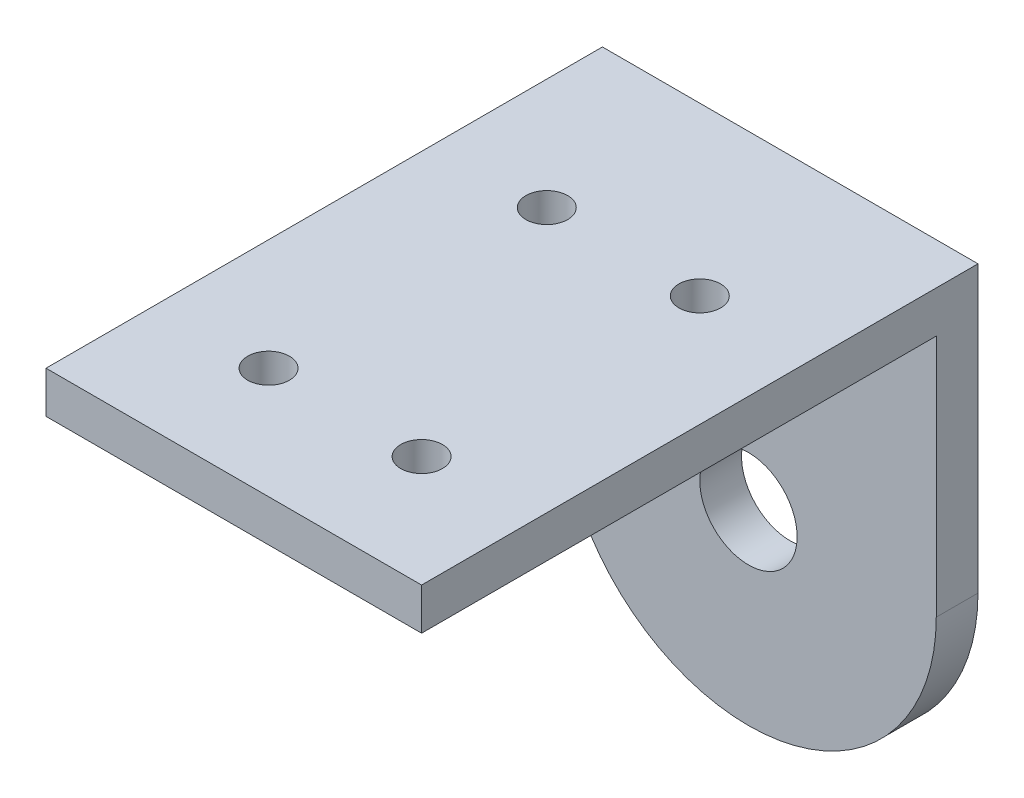
ISO-10303-21;
HEADER;
FILE_DESCRIPTION(('STEP AP214'),'2;1');
FILE_NAME('part.step','',(''),(''),'','','');
FILE_SCHEMA(('AUTOMOTIVE_DESIGN { 1 0 10303 214 1 1 1 1 }'));
ENDSEC;
DATA;
#1=APPLICATION_CONTEXT('core data for automotive mechanical design processes');
#2=APPLICATION_PROTOCOL_DEFINITION('international standard','automotive_design',2000,#1);
#3=PRODUCT_CONTEXT('',#1,'mechanical');
#4=PRODUCT('Part','Part','',(#3));
#5=PRODUCT_RELATED_PRODUCT_CATEGORY('part','',(#4));
#6=PRODUCT_DEFINITION_FORMATION('','',#4);
#7=PRODUCT_DEFINITION_CONTEXT('part definition',#1,'design');
#8=PRODUCT_DEFINITION('design','',#6,#7);
#9=PRODUCT_DEFINITION_SHAPE('','',#8);
#10=(LENGTH_UNIT() NAMED_UNIT(*) SI_UNIT(.MILLI.,.METRE.));
#11=(NAMED_UNIT(*) PLANE_ANGLE_UNIT() SI_UNIT($,.RADIAN.));
#12=(NAMED_UNIT(*) SI_UNIT($,.STERADIAN.) SOLID_ANGLE_UNIT());
#13=UNCERTAINTY_MEASURE_WITH_UNIT(LENGTH_MEASURE(1.E-05),#10,'distance_accuracy_value','');
#14=(GEOMETRIC_REPRESENTATION_CONTEXT(3) GLOBAL_UNCERTAINTY_ASSIGNED_CONTEXT((#13)) GLOBAL_UNIT_ASSIGNED_CONTEXT((#10,
#11,#12)) REPRESENTATION_CONTEXT('',''));
#15=CARTESIAN_POINT('',(0.,0.,0.));
#16=DIRECTION('',(0.,0.,1.));
#17=DIRECTION('',(1.,0.,0.));
#18=AXIS2_PLACEMENT_3D('',#15,#16,#17);
#19=CARTESIAN_POINT('',(2606.26671450499,1592.8264256332,40.));
#20=DIRECTION('',(0.,0.,1.));
#21=DIRECTION('',(1.,0.,0.));
#22=AXIS2_PLACEMENT_3D('',#19,#20,#21);
#23=PLANE('',#22);
#24=DIRECTION('',(1.,0.,0.));
#25=VECTOR('',#24,1.);
#26=CARTESIAN_POINT('',(2579.76671450502,1610.3264256332,40.));
#27=LINE('',#26,#25);
#28=CARTESIAN_POINT('',(2592.76671450499,1610.3264256332,40.));
#29=VERTEX_POINT('',#28);
#30=CARTESIAN_POINT('',(2619.76671450502,1610.3264256332,40.));
#31=VERTEX_POINT('',#30);
#32=EDGE_CURVE('E122',#29,#31,#27,.T.);
#33=ORIENTED_EDGE('',*,*,#32,.T.);
#34=DIRECTION('',(0.,1.,0.));
#35=VECTOR('',#34,1.);
#36=CARTESIAN_POINT('',(2619.76671450499,1592.8264256332,40.));
#37=LINE('',#36,#35);
#38=CARTESIAN_POINT('',(2619.76671450499,1613.3264256332,40.));
#39=VERTEX_POINT('',#38);
#40=EDGE_CURVE('E98',#31,#39,#37,.T.);
#41=ORIENTED_EDGE('',*,*,#40,.T.);
#42=DIRECTION('',(-1.,0.,0.));
#43=VECTOR('',#42,1.);
#44=CARTESIAN_POINT('',(2592.76671450499,1613.3264256332,40.));
#45=LINE('',#44,#43);
#46=CARTESIAN_POINT('',(2592.76671450499,1613.3264256332,40.));
#47=VERTEX_POINT('',#46);
#48=EDGE_CURVE('E58',#39,#47,#45,.T.);
#49=ORIENTED_EDGE('',*,*,#48,.T.);
#50=DIRECTION('',(0.,-1.,0.));
#51=VECTOR('',#50,1.);
#52=CARTESIAN_POINT('',(2592.76671450499,1592.8264256332,40.));
#53=LINE('',#52,#51);
#54=EDGE_CURVE('E89',#47,#29,#53,.T.);
#55=ORIENTED_EDGE('',*,*,#54,.T.);
#56=EDGE_LOOP('',(#33,#41,#49,#55));
#57=FACE_BOUND('',#56,.T.);
#58=ADVANCED_FACE('F32',(#57),#23,.T.);
#59=CARTESIAN_POINT('',(2606.26671450499,1592.8264256332,0.));
#60=DIRECTION('',(0.,0.,1.));
#61=DIRECTION('',(1.,0.,0.));
#62=AXIS2_PLACEMENT_3D('',#59,#60,#61);
#63=PLANE('',#62);
#64=CARTESIAN_POINT('',(2606.26671450499,1592.8264256332,0.));
#65=DIRECTION('',(0.,0.,1.));
#66=DIRECTION('',(1.,0.,0.));
#67=AXIS2_PLACEMENT_3D('',#64,#65,#66);
#68=CIRCLE('',#67,13.5000000000001);
#69=CARTESIAN_POINT('',(2592.76671450499,1592.8264256332,0.));
#70=VERTEX_POINT('',#69);
#71=CARTESIAN_POINT('',(2619.76671450499,1592.8264256332,0.));
#72=VERTEX_POINT('',#71);
#73=EDGE_CURVE('E82',#70,#72,#68,.T.);
#74=ORIENTED_EDGE('',*,*,#73,.F.);
#75=DIRECTION('',(0.,-1.,0.));
#76=VECTOR('',#75,1.);
#77=CARTESIAN_POINT('',(2592.76671450499,1592.8264256332,0.));
#78=LINE('',#77,#76);
#79=CARTESIAN_POINT('',(2592.76671450499,1613.3264256332,0.));
#80=VERTEX_POINT('',#79);
#81=EDGE_CURVE('E93',#80,#70,#78,.T.);
#82=ORIENTED_EDGE('',*,*,#81,.F.);
#83=DIRECTION('',(-1.,0.,0.));
#84=VECTOR('',#83,1.);
#85=CARTESIAN_POINT('',(2592.76671450499,1613.3264256332,0.));
#86=LINE('',#85,#84);
#87=CARTESIAN_POINT('',(2619.76671450499,1613.3264256332,0.));
#88=VERTEX_POINT('',#87);
#89=EDGE_CURVE('E99',#88,#80,#86,.T.);
#90=ORIENTED_EDGE('',*,*,#89,.F.);
#91=DIRECTION('',(0.,1.,0.));
#92=VECTOR('',#91,1.);
#93=CARTESIAN_POINT('',(2619.76671450499,1592.8264256332,0.));
#94=LINE('',#93,#92);
#95=EDGE_CURVE('E104',#72,#88,#94,.T.);
#96=ORIENTED_EDGE('',*,*,#95,.F.);
#97=EDGE_LOOP('',(#74,#82,#90,#96));
#98=FACE_BOUND('',#97,.T.);
#99=CARTESIAN_POINT('',(2606.26671450499,1592.8264256332,0.));
#100=DIRECTION('',(0.,0.,1.));
#101=DIRECTION('',(1.,0.,0.));
#102=AXIS2_PLACEMENT_3D('',#99,#100,#101);
#103=CIRCLE('',#102,3.49999999999984);
#104=CARTESIAN_POINT('',(2609.76671450499,1592.8264256332,0.));
#105=VERTEX_POINT('',#104);
#106=EDGE_CURVE('E105',#105,#105,#103,.T.);
#107=ORIENTED_EDGE('',*,*,#106,.T.);
#108=EDGE_LOOP('',(#107));
#109=FACE_BOUND('',#108,.T.);
#110=ADVANCED_FACE('F102',(#98,#109),#63,.F.);
#111=CARTESIAN_POINT('',(2606.26671450499,1592.8264256332,40.));
#112=DIRECTION('',(0.,0.,-1.));
#113=DIRECTION('',(-1.,0.,0.));
#114=AXIS2_PLACEMENT_3D('',#111,#112,#113);
#115=CYLINDRICAL_SURFACE('',#114,13.5000000000001);
#116=DIRECTION('',(0.,0.,-1.));
#117=VECTOR('',#116,1.);
#118=CARTESIAN_POINT('',(2619.76671450499,1592.8264256332,40.));
#119=LINE('',#118,#117);
#120=CARTESIAN_POINT('',(2619.76671450502,1592.8264256332,3.));
#121=VERTEX_POINT('',#120);
#122=EDGE_CURVE('E41',#121,#72,#119,.T.);
#123=ORIENTED_EDGE('',*,*,#122,.F.);
#124=CARTESIAN_POINT('',(2606.26671450499,1592.8264256332,3.));
#125=DIRECTION('',(0.,0.,-1.));
#126=DIRECTION('',(0.,1.,0.));
#127=AXIS2_PLACEMENT_3D('',#124,#125,#126);
#128=CIRCLE('',#127,13.5000000000001);
#129=CARTESIAN_POINT('',(2592.76671450499,1592.8264256332,3.));
#130=VERTEX_POINT('',#129);
#131=EDGE_CURVE('E85',#121,#130,#128,.T.);
#132=ORIENTED_EDGE('',*,*,#131,.T.);
#133=DIRECTION('',(0.,0.,-1.));
#134=VECTOR('',#133,1.);
#135=CARTESIAN_POINT('',(2592.76671450499,1592.8264256332,40.));
#136=LINE('',#135,#134);
#137=EDGE_CURVE('E78',#130,#70,#136,.T.);
#138=ORIENTED_EDGE('',*,*,#137,.T.);
#139=ORIENTED_EDGE('',*,*,#73,.T.);
#140=EDGE_LOOP('',(#123,#132,#138,#139));
#141=FACE_BOUND('',#140,.T.);
#142=ADVANCED_FACE('F34',(#141),#115,.T.);
#143=CARTESIAN_POINT('',(2619.76671450499,1592.8264256332,40.));
#144=DIRECTION('',(-1.,0.,0.));
#145=DIRECTION('',(0.,0.,1.));
#146=AXIS2_PLACEMENT_3D('',#143,#144,#145);
#147=PLANE('',#146);
#148=ORIENTED_EDGE('',*,*,#40,.F.);
#149=DIRECTION('',(0.,0.,1.));
#150=VECTOR('',#149,1.);
#151=CARTESIAN_POINT('',(2619.76671450502,1610.3264256332,40.));
#152=LINE('',#151,#150);
#153=CARTESIAN_POINT('',(2619.76671450502,1610.3264256332,3.));
#154=VERTEX_POINT('',#153);
#155=EDGE_CURVE('E150',#154,#31,#152,.T.);
#156=ORIENTED_EDGE('',*,*,#155,.F.);
#157=DIRECTION('',(0.,1.,0.));
#158=VECTOR('',#157,1.);
#159=CARTESIAN_POINT('',(2619.76671450502,1610.3264256332,3.));
#160=LINE('',#159,#158);
#161=EDGE_CURVE('E127',#121,#154,#160,.T.);
#162=ORIENTED_EDGE('',*,*,#161,.F.);
#163=ORIENTED_EDGE('',*,*,#122,.T.);
#164=ORIENTED_EDGE('',*,*,#95,.T.);
#165=DIRECTION('',(0.,0.,-1.));
#166=VECTOR('',#165,1.);
#167=CARTESIAN_POINT('',(2619.76671450499,1613.3264256332,40.));
#168=LINE('',#167,#166);
#169=EDGE_CURVE('E115',#39,#88,#168,.T.);
#170=ORIENTED_EDGE('',*,*,#169,.F.);
#171=EDGE_LOOP('',(#148,#156,#162,#163,#164,#170));
#172=FACE_BOUND('',#171,.T.);
#173=ADVANCED_FACE('F169',(#172),#147,.F.);
#174=CARTESIAN_POINT('',(2592.76671450499,1613.3264256332,40.));
#175=DIRECTION('',(0.,-1.,0.));
#176=DIRECTION('',(0.,0.,-1.));
#177=AXIS2_PLACEMENT_3D('',#174,#175,#176);
#178=PLANE('',#177);
#179=CARTESIAN_POINT('',(2600.76671450499,1613.3264256332,12.));
#180=DIRECTION('',(0.,1.,0.));
#181=DIRECTION('',(0.,0.,1.));
#182=AXIS2_PLACEMENT_3D('',#179,#180,#181);
#183=CIRCLE('',#182,1.50000000000008);
#184=CARTESIAN_POINT('',(2600.76671450499,1613.3264256332,13.5000000000001));
#185=VERTEX_POINT('',#184);
#186=EDGE_CURVE('E144',#185,#185,#183,.T.);
#187=ORIENTED_EDGE('',*,*,#186,.F.);
#188=EDGE_LOOP('',(#187));
#189=FACE_BOUND('',#188,.T.);
#190=CARTESIAN_POINT('',(2611.76671450499,1613.3264256332,12.));
#191=DIRECTION('',(0.,1.,0.));
#192=DIRECTION('',(0.,0.,1.));
#193=AXIS2_PLACEMENT_3D('',#190,#191,#192);
#194=CIRCLE('',#193,1.50000000000008);
#195=CARTESIAN_POINT('',(2611.76671450499,1613.3264256332,13.5000000000001));
#196=VERTEX_POINT('',#195);
#197=EDGE_CURVE('E134',#196,#196,#194,.T.);
#198=ORIENTED_EDGE('',*,*,#197,.F.);
#199=EDGE_LOOP('',(#198));
#200=FACE_BOUND('',#199,.T.);
#201=CARTESIAN_POINT('',(2611.76671450499,1613.3264256332,32.));
#202=DIRECTION('',(0.,1.,0.));
#203=DIRECTION('',(0.,0.,1.));
#204=AXIS2_PLACEMENT_3D('',#201,#202,#203);
#205=CIRCLE('',#204,1.50000000000008);
#206=CARTESIAN_POINT('',(2611.76671450499,1613.3264256332,33.5000000000001));
#207=VERTEX_POINT('',#206);
#208=EDGE_CURVE('E131',#207,#207,#205,.T.);
#209=ORIENTED_EDGE('',*,*,#208,.F.);
#210=EDGE_LOOP('',(#209));
#211=FACE_BOUND('',#210,.T.);
#212=CARTESIAN_POINT('',(2600.76671450499,1613.3264256332,32.));
#213=DIRECTION('',(0.,1.,0.));
#214=DIRECTION('',(0.,0.,1.));
#215=AXIS2_PLACEMENT_3D('',#212,#213,#214);
#216=CIRCLE('',#215,1.50000000000008);
#217=CARTESIAN_POINT('',(2600.76671450499,1613.3264256332,33.5000000000001));
#218=VERTEX_POINT('',#217);
#219=EDGE_CURVE('E128',#218,#218,#216,.T.);
#220=ORIENTED_EDGE('',*,*,#219,.F.);
#221=EDGE_LOOP('',(#220));
#222=FACE_BOUND('',#221,.T.);
#223=ORIENTED_EDGE('',*,*,#89,.T.);
#224=DIRECTION('',(0.,0.,-1.));
#225=VECTOR('',#224,1.);
#226=CARTESIAN_POINT('',(2592.76671450499,1613.3264256332,40.));
#227=LINE('',#226,#225);
#228=EDGE_CURVE('E88',#47,#80,#227,.T.);
#229=ORIENTED_EDGE('',*,*,#228,.F.);
#230=ORIENTED_EDGE('',*,*,#48,.F.);
#231=ORIENTED_EDGE('',*,*,#169,.T.);
#232=EDGE_LOOP('',(#223,#229,#230,#231));
#233=FACE_BOUND('',#232,.T.);
#234=ADVANCED_FACE('F199',(#189,#200,#211,#222,#233),#178,.F.);
#235=CARTESIAN_POINT('',(2592.76671450499,1592.8264256332,40.));
#236=DIRECTION('',(1.,0.,0.));
#237=DIRECTION('',(0.,0.,-1.));
#238=AXIS2_PLACEMENT_3D('',#235,#236,#237);
#239=PLANE('',#238);
#240=DIRECTION('',(0.,1.,0.));
#241=VECTOR('',#240,1.);
#242=CARTESIAN_POINT('',(2592.76671450499,1592.8264256332,3.));
#243=LINE('',#242,#241);
#244=CARTESIAN_POINT('',(2592.76671450499,1610.3264256332,3.));
#245=VERTEX_POINT('',#244);
#246=EDGE_CURVE('E121',#130,#245,#243,.T.);
#247=ORIENTED_EDGE('',*,*,#246,.T.);
#248=DIRECTION('',(0.,0.,1.));
#249=VECTOR('',#248,1.);
#250=CARTESIAN_POINT('',(2592.76671450499,1610.3264256332,40.));
#251=LINE('',#250,#249);
#252=EDGE_CURVE('E11',#245,#29,#251,.T.);
#253=ORIENTED_EDGE('',*,*,#252,.T.);
#254=ORIENTED_EDGE('',*,*,#54,.F.);
#255=ORIENTED_EDGE('',*,*,#228,.T.);
#256=ORIENTED_EDGE('',*,*,#81,.T.);
#257=ORIENTED_EDGE('',*,*,#137,.F.);
#258=EDGE_LOOP('',(#247,#253,#254,#255,#256,#257));
#259=FACE_BOUND('',#258,.T.);
#260=ADVANCED_FACE('F94',(#259),#239,.F.);
#261=CARTESIAN_POINT('',(2606.26671450499,1592.8264256332,40.));
#262=DIRECTION('',(0.,0.,-1.));
#263=DIRECTION('',(-1.,0.,0.));
#264=AXIS2_PLACEMENT_3D('',#261,#262,#263);
#265=CYLINDRICAL_SURFACE('',#264,3.49999999999984);
#266=CARTESIAN_POINT('',(2606.26671450499,1592.8264256332,3.));
#267=DIRECTION('',(0.,0.,-1.));
#268=DIRECTION('',(0.,1.,0.));
#269=AXIS2_PLACEMENT_3D('',#266,#267,#268);
#270=CIRCLE('',#269,3.49999999999984);
#271=CARTESIAN_POINT('',(2606.26671450499,1596.3264256332,3.));
#272=VERTEX_POINT('',#271);
#273=EDGE_CURVE('E119',#272,#272,#270,.T.);
#274=ORIENTED_EDGE('',*,*,#273,.F.);
#275=EDGE_LOOP('',(#274));
#276=FACE_BOUND('',#275,.T.);
#277=ORIENTED_EDGE('',*,*,#106,.F.);
#278=EDGE_LOOP('',(#277));
#279=FACE_BOUND('',#278,.T.);
#280=ADVANCED_FACE('F186',(#276,#279),#265,.F.);
#281=CARTESIAN_POINT('',(2579.76671450502,1610.3264256332,40.));
#282=DIRECTION('',(0.,1.,0.));
#283=DIRECTION('',(-1.,0.,0.));
#284=AXIS2_PLACEMENT_3D('',#281,#282,#283);
#285=PLANE('',#284);
#286=CARTESIAN_POINT('',(2600.76671450499,1610.3264256332,12.));
#287=DIRECTION('',(0.,1.,0.));
#288=DIRECTION('',(-1.,0.,0.));
#289=AXIS2_PLACEMENT_3D('',#286,#287,#288);
#290=CIRCLE('',#289,1.50000000000008);
#291=CARTESIAN_POINT('',(2599.26671450499,1610.3264256332,12.));
#292=VERTEX_POINT('',#291);
#293=EDGE_CURVE('E36',#292,#292,#290,.T.);
#294=ORIENTED_EDGE('',*,*,#293,.T.);
#295=EDGE_LOOP('',(#294));
#296=FACE_BOUND('',#295,.T.);
#297=CARTESIAN_POINT('',(2611.76671450499,1610.3264256332,12.));
#298=DIRECTION('',(0.,1.,0.));
#299=DIRECTION('',(-1.,0.,0.));
#300=AXIS2_PLACEMENT_3D('',#297,#298,#299);
#301=CIRCLE('',#300,1.50000000000008);
#302=CARTESIAN_POINT('',(2610.26671450499,1610.3264256332,12.));
#303=VERTEX_POINT('',#302);
#304=EDGE_CURVE('E132',#303,#303,#301,.T.);
#305=ORIENTED_EDGE('',*,*,#304,.T.);
#306=EDGE_LOOP('',(#305));
#307=FACE_BOUND('',#306,.T.);
#308=CARTESIAN_POINT('',(2611.76671450499,1610.3264256332,32.));
#309=DIRECTION('',(0.,1.,0.));
#310=DIRECTION('',(-1.,0.,0.));
#311=AXIS2_PLACEMENT_3D('',#308,#309,#310);
#312=CIRCLE('',#311,1.50000000000008);
#313=CARTESIAN_POINT('',(2610.26671450499,1610.3264256332,32.));
#314=VERTEX_POINT('',#313);
#315=EDGE_CURVE('E129',#314,#314,#312,.T.);
#316=ORIENTED_EDGE('',*,*,#315,.T.);
#317=EDGE_LOOP('',(#316));
#318=FACE_BOUND('',#317,.T.);
#319=CARTESIAN_POINT('',(2600.76671450499,1610.3264256332,32.));
#320=DIRECTION('',(0.,1.,0.));
#321=DIRECTION('',(-1.,0.,0.));
#322=AXIS2_PLACEMENT_3D('',#319,#320,#321);
#323=CIRCLE('',#322,1.50000000000008);
#324=CARTESIAN_POINT('',(2599.26671450499,1610.3264256332,32.));
#325=VERTEX_POINT('',#324);
#326=EDGE_CURVE('E124',#325,#325,#323,.T.);
#327=ORIENTED_EDGE('',*,*,#326,.T.);
#328=EDGE_LOOP('',(#327));
#329=FACE_BOUND('',#328,.T.);
#330=DIRECTION('',(1.,0.,0.));
#331=VECTOR('',#330,1.);
#332=CARTESIAN_POINT('',(2579.76671450502,1610.3264256332,3.));
#333=LINE('',#332,#331);
#334=EDGE_CURVE('E49',#245,#154,#333,.T.);
#335=ORIENTED_EDGE('',*,*,#334,.T.);
#336=ORIENTED_EDGE('',*,*,#155,.T.);
#337=ORIENTED_EDGE('',*,*,#32,.F.);
#338=ORIENTED_EDGE('',*,*,#252,.F.);
#339=EDGE_LOOP('',(#335,#336,#337,#338));
#340=FACE_BOUND('',#339,.T.);
#341=ADVANCED_FACE('F162',(#296,#307,#318,#329,#340),#285,.F.);
#342=CARTESIAN_POINT('',(2579.76671450502,1610.3264256332,3.));
#343=DIRECTION('',(0.,0.,-1.));
#344=DIRECTION('',(0.,1.,0.));
#345=AXIS2_PLACEMENT_3D('',#342,#343,#344);
#346=PLANE('',#345);
#347=ORIENTED_EDGE('',*,*,#273,.T.);
#348=EDGE_LOOP('',(#347));
#349=FACE_BOUND('',#348,.T.);
#350=ORIENTED_EDGE('',*,*,#161,.T.);
#351=ORIENTED_EDGE('',*,*,#334,.F.);
#352=ORIENTED_EDGE('',*,*,#246,.F.);
#353=ORIENTED_EDGE('',*,*,#131,.F.);
#354=EDGE_LOOP('',(#350,#351,#352,#353));
#355=FACE_BOUND('',#354,.T.);
#356=ADVANCED_FACE('F174',(#349,#355),#346,.F.);
#357=CARTESIAN_POINT('',(2600.76671450499,1573.3264256332,32.));
#358=DIRECTION('',(0.,1.,0.));
#359=DIRECTION('',(0.,0.,1.));
#360=AXIS2_PLACEMENT_3D('',#357,#358,#359);
#361=CYLINDRICAL_SURFACE('',#360,1.50000000000008);
#362=ORIENTED_EDGE('',*,*,#219,.T.);
#363=EDGE_LOOP('',(#362));
#364=FACE_BOUND('',#363,.T.);
#365=ORIENTED_EDGE('',*,*,#326,.F.);
#366=EDGE_LOOP('',(#365));
#367=FACE_BOUND('',#366,.T.);
#368=ADVANCED_FACE('F176',(#364,#367),#361,.F.);
#369=CARTESIAN_POINT('',(2611.76671450499,1573.3264256332,32.));
#370=DIRECTION('',(0.,1.,0.));
#371=DIRECTION('',(0.,0.,1.));
#372=AXIS2_PLACEMENT_3D('',#369,#370,#371);
#373=CYLINDRICAL_SURFACE('',#372,1.50000000000008);
#374=ORIENTED_EDGE('',*,*,#208,.T.);
#375=EDGE_LOOP('',(#374));
#376=FACE_BOUND('',#375,.T.);
#377=ORIENTED_EDGE('',*,*,#315,.F.);
#378=EDGE_LOOP('',(#377));
#379=FACE_BOUND('',#378,.T.);
#380=ADVANCED_FACE('F183',(#376,#379),#373,.F.);
#381=CARTESIAN_POINT('',(2611.76671450499,1573.3264256332,12.));
#382=DIRECTION('',(0.,1.,0.));
#383=DIRECTION('',(0.,0.,1.));
#384=AXIS2_PLACEMENT_3D('',#381,#382,#383);
#385=CYLINDRICAL_SURFACE('',#384,1.50000000000008);
#386=ORIENTED_EDGE('',*,*,#197,.T.);
#387=EDGE_LOOP('',(#386));
#388=FACE_BOUND('',#387,.T.);
#389=ORIENTED_EDGE('',*,*,#304,.F.);
#390=EDGE_LOOP('',(#389));
#391=FACE_BOUND('',#390,.T.);
#392=ADVANCED_FACE('F263',(#388,#391),#385,.F.);
#393=CARTESIAN_POINT('',(2600.76671450499,1573.3264256332,12.));
#394=DIRECTION('',(0.,1.,0.));
#395=DIRECTION('',(0.,0.,1.));
#396=AXIS2_PLACEMENT_3D('',#393,#394,#395);
#397=CYLINDRICAL_SURFACE('',#396,1.50000000000008);
#398=ORIENTED_EDGE('',*,*,#186,.T.);
#399=EDGE_LOOP('',(#398));
#400=FACE_BOUND('',#399,.T.);
#401=ORIENTED_EDGE('',*,*,#293,.F.);
#402=EDGE_LOOP('',(#401));
#403=FACE_BOUND('',#402,.T.);
#404=ADVANCED_FACE('F272',(#400,#403),#397,.F.);
#405=CLOSED_SHELL('',(#58,#110,#142,#173,#234,#260,#280,#341,#356,#368,#380,#392,#404));
#406=MANIFOLD_SOLID_BREP('B2',#405);
#407=ADVANCED_BREP_SHAPE_REPRESENTATION('',(#18,#406),#14);
#408=SHAPE_DEFINITION_REPRESENTATION(#9,#407);
ENDSEC;
END-ISO-10303-21;
